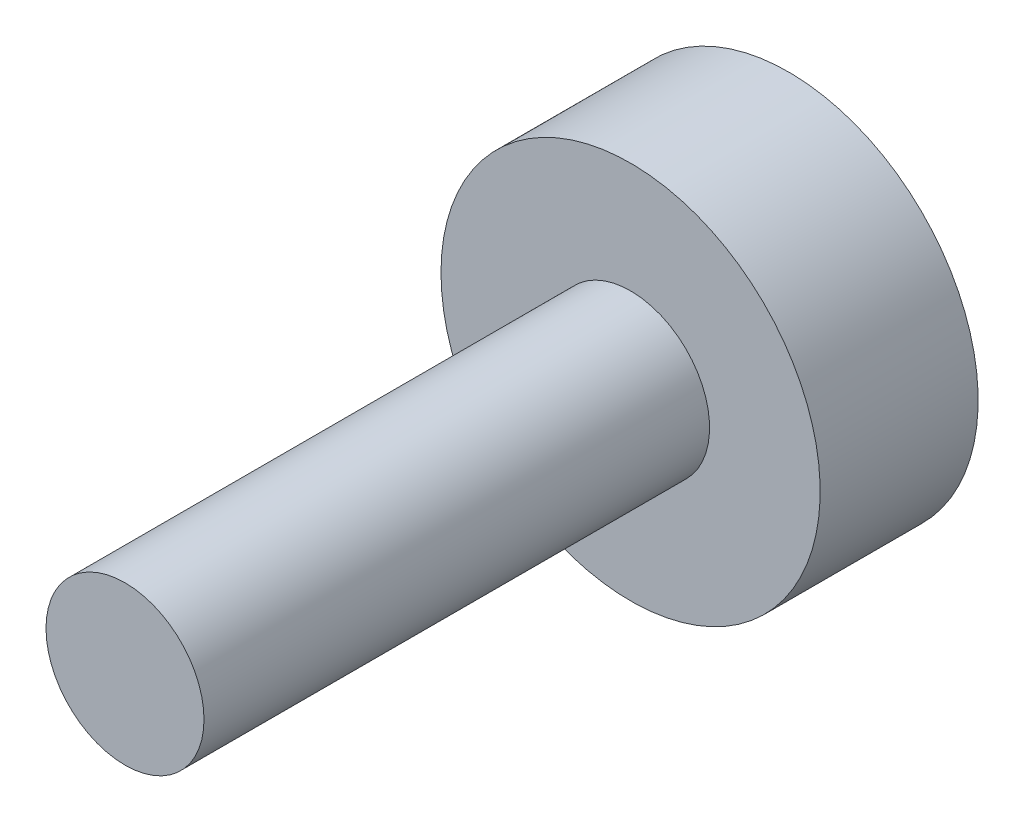
ISO-10303-21;
HEADER;
FILE_DESCRIPTION(('STEP AP214'),'2;1');
FILE_NAME('part.step','',(''),(''),'','','');
FILE_SCHEMA(('AUTOMOTIVE_DESIGN { 1 0 10303 214 1 1 1 1 }'));
ENDSEC;
DATA;
#1=APPLICATION_CONTEXT('core data for automotive mechanical design processes');
#2=APPLICATION_PROTOCOL_DEFINITION('international standard','automotive_design',2000,#1);
#3=PRODUCT_CONTEXT('',#1,'mechanical');
#4=PRODUCT('Part','Part','',(#3));
#5=PRODUCT_RELATED_PRODUCT_CATEGORY('part','',(#4));
#6=PRODUCT_DEFINITION_FORMATION('','',#4);
#7=PRODUCT_DEFINITION_CONTEXT('part definition',#1,'design');
#8=PRODUCT_DEFINITION('design','',#6,#7);
#9=PRODUCT_DEFINITION_SHAPE('','',#8);
#10=(LENGTH_UNIT() NAMED_UNIT(*) SI_UNIT(.MILLI.,.METRE.));
#11=(NAMED_UNIT(*) PLANE_ANGLE_UNIT() SI_UNIT($,.RADIAN.));
#12=(NAMED_UNIT(*) SI_UNIT($,.STERADIAN.) SOLID_ANGLE_UNIT());
#13=UNCERTAINTY_MEASURE_WITH_UNIT(LENGTH_MEASURE(1.E-05),#10,'distance_accuracy_value','');
#14=(GEOMETRIC_REPRESENTATION_CONTEXT(3) GLOBAL_UNCERTAINTY_ASSIGNED_CONTEXT((#13)) GLOBAL_UNIT_ASSIGNED_CONTEXT((#10,
#11,#12)) REPRESENTATION_CONTEXT('',''));
#15=CARTESIAN_POINT('',(0.,0.,0.));
#16=DIRECTION('',(0.,0.,1.));
#17=DIRECTION('',(1.,0.,0.));
#18=AXIS2_PLACEMENT_3D('',#15,#16,#17);
#19=CARTESIAN_POINT('',(0.,0.,16.));
#20=DIRECTION('',(0.,0.,-1.));
#21=DIRECTION('',(-1.,0.,0.));
#22=AXIS2_PLACEMENT_3D('',#19,#20,#21);
#23=CYLINDRICAL_SURFACE('',#22,2.5);
#24=CARTESIAN_POINT('',(0.,0.,16.));
#25=DIRECTION('',(0.,0.,1.));
#26=DIRECTION('',(1.,0.,0.));
#27=AXIS2_PLACEMENT_3D('',#24,#25,#26);
#28=CIRCLE('',#27,2.5);
#29=CARTESIAN_POINT('',(2.5,0.,16.));
#30=VERTEX_POINT('',#29);
#31=EDGE_CURVE('E10',#30,#30,#28,.T.);
#32=ORIENTED_EDGE('',*,*,#31,.F.);
#33=EDGE_LOOP('',(#32));
#34=FACE_BOUND('',#33,.T.);
#35=CARTESIAN_POINT('',(0.,0.,0.));
#36=DIRECTION('',(0.,0.,-1.));
#37=DIRECTION('',(-1.,0.,0.));
#38=AXIS2_PLACEMENT_3D('',#35,#36,#37);
#39=CIRCLE('',#38,2.5);
#40=CARTESIAN_POINT('',(-2.5,0.,0.));
#41=VERTEX_POINT('',#40);
#42=EDGE_CURVE('E37',#41,#41,#39,.T.);
#43=ORIENTED_EDGE('',*,*,#42,.F.);
#44=EDGE_LOOP('',(#43));
#45=FACE_BOUND('',#44,.T.);
#46=ADVANCED_FACE('F31',(#34,#45),#23,.T.);
#47=CARTESIAN_POINT('',(0.,0.,16.));
#48=DIRECTION('',(0.,0.,1.));
#49=DIRECTION('',(1.,0.,0.));
#50=AXIS2_PLACEMENT_3D('',#47,#48,#49);
#51=PLANE('',#50);
#52=ORIENTED_EDGE('',*,*,#31,.T.);
#53=EDGE_LOOP('',(#52));
#54=FACE_BOUND('',#53,.T.);
#55=ADVANCED_FACE('F55',(#54),#51,.T.);
#56=CARTESIAN_POINT('',(0.,0.,0.));
#57=DIRECTION('',(0.,0.,-1.));
#58=DIRECTION('',(-1.,0.,0.));
#59=AXIS2_PLACEMENT_3D('',#56,#57,#58);
#60=PLANE('',#59);
#61=CARTESIAN_POINT('',(0.,0.,0.));
#62=DIRECTION('',(0.,0.,-1.));
#63=DIRECTION('',(-1.,0.,0.));
#64=AXIS2_PLACEMENT_3D('',#61,#62,#63);
#65=CIRCLE('',#64,6.);
#66=CARTESIAN_POINT('',(-6.,0.,0.));
#67=VERTEX_POINT('',#66);
#68=EDGE_CURVE('E45',#67,#67,#65,.T.);
#69=ORIENTED_EDGE('',*,*,#68,.F.);
#70=EDGE_LOOP('',(#69));
#71=FACE_BOUND('',#70,.T.);
#72=ORIENTED_EDGE('',*,*,#42,.T.);
#73=EDGE_LOOP('',(#72));
#74=FACE_BOUND('',#73,.T.);
#75=ADVANCED_FACE('F53',(#71,#74),#60,.F.);
#76=CARTESIAN_POINT('',(0.,0.,-5.));
#77=DIRECTION('',(0.,0.,1.));
#78=DIRECTION('',(1.,0.,0.));
#79=AXIS2_PLACEMENT_3D('',#76,#77,#78);
#80=CYLINDRICAL_SURFACE('',#79,6.);
#81=CARTESIAN_POINT('',(0.,0.,-5.));
#82=DIRECTION('',(0.,0.,-1.));
#83=DIRECTION('',(-1.,0.,0.));
#84=AXIS2_PLACEMENT_3D('',#81,#82,#83);
#85=CIRCLE('',#84,6.);
#86=CARTESIAN_POINT('',(-6.,0.,-5.));
#87=VERTEX_POINT('',#86);
#88=EDGE_CURVE('E41',#87,#87,#85,.T.);
#89=ORIENTED_EDGE('',*,*,#88,.F.);
#90=EDGE_LOOP('',(#89));
#91=FACE_BOUND('',#90,.T.);
#92=ORIENTED_EDGE('',*,*,#68,.T.);
#93=EDGE_LOOP('',(#92));
#94=FACE_BOUND('',#93,.T.);
#95=ADVANCED_FACE('F51',(#91,#94),#80,.T.);
#96=CARTESIAN_POINT('',(0.,0.,-5.));
#97=DIRECTION('',(0.,0.,-1.));
#98=DIRECTION('',(-1.,0.,0.));
#99=AXIS2_PLACEMENT_3D('',#96,#97,#98);
#100=PLANE('',#99);
#101=ORIENTED_EDGE('',*,*,#88,.T.);
#102=EDGE_LOOP('',(#101));
#103=FACE_BOUND('',#102,.T.);
#104=ADVANCED_FACE('F61',(#103),#100,.T.);
#105=CLOSED_SHELL('',(#46,#55,#75,#95,#104));
#106=MANIFOLD_SOLID_BREP('B2',#105);
#107=ADVANCED_BREP_SHAPE_REPRESENTATION('',(#18,#106),#14);
#108=SHAPE_DEFINITION_REPRESENTATION(#9,#107);
ENDSEC;
END-ISO-10303-21;
